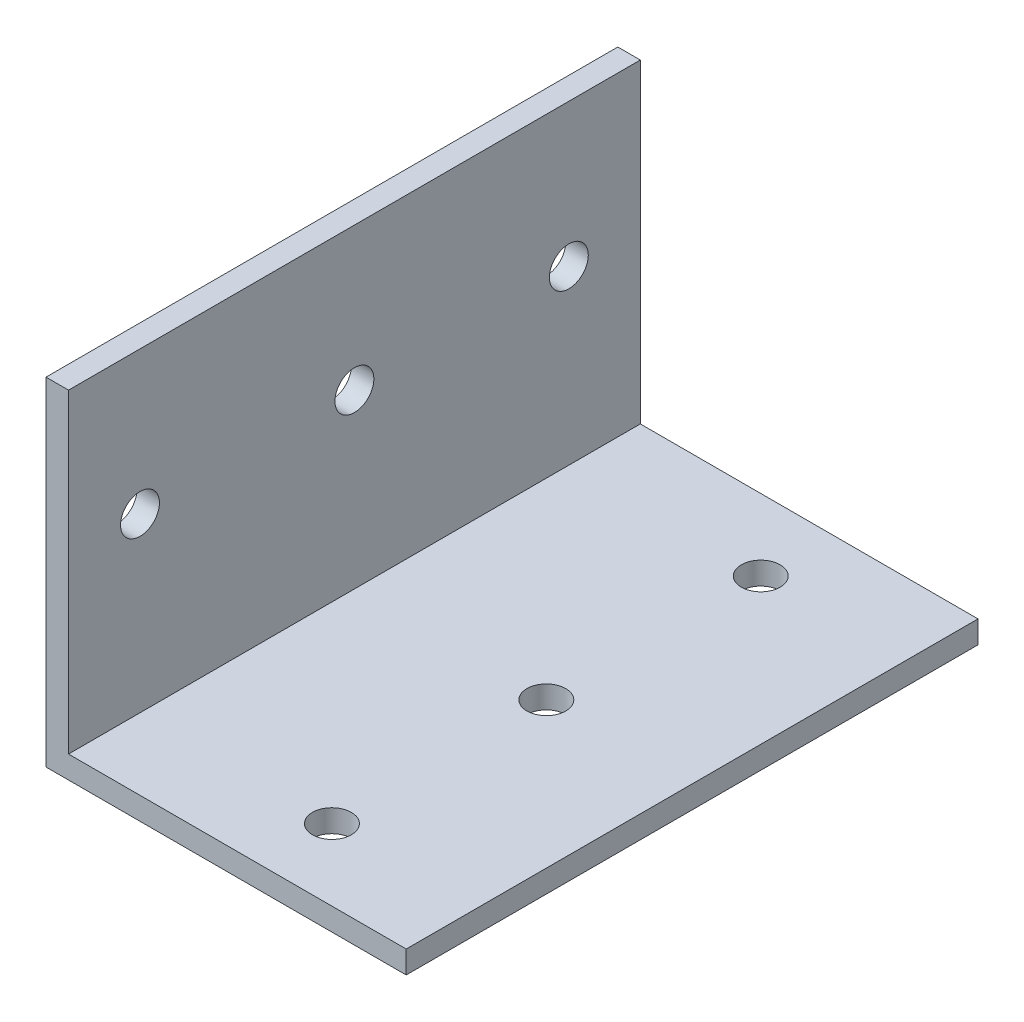
ISO-10303-21;
HEADER;
FILE_DESCRIPTION(('STEP AP214'),'2;1');
FILE_NAME('part.step','',(''),(''),'','','');
FILE_SCHEMA(('AUTOMOTIVE_DESIGN { 1 0 10303 214 1 1 1 1 }'));
ENDSEC;
DATA;
#1=APPLICATION_CONTEXT('core data for automotive mechanical design processes');
#2=APPLICATION_PROTOCOL_DEFINITION('international standard','automotive_design',2000,#1);
#3=PRODUCT_CONTEXT('',#1,'mechanical');
#4=PRODUCT('Part','Part','',(#3));
#5=PRODUCT_RELATED_PRODUCT_CATEGORY('part','',(#4));
#6=PRODUCT_DEFINITION_FORMATION('','',#4);
#7=PRODUCT_DEFINITION_CONTEXT('part definition',#1,'design');
#8=PRODUCT_DEFINITION('design','',#6,#7);
#9=PRODUCT_DEFINITION_SHAPE('','',#8);
#10=(LENGTH_UNIT() NAMED_UNIT(*) SI_UNIT(.MILLI.,.METRE.));
#11=(NAMED_UNIT(*) PLANE_ANGLE_UNIT() SI_UNIT($,.RADIAN.));
#12=(NAMED_UNIT(*) SI_UNIT($,.STERADIAN.) SOLID_ANGLE_UNIT());
#13=UNCERTAINTY_MEASURE_WITH_UNIT(LENGTH_MEASURE(1.E-05),#10,'distance_accuracy_value','');
#14=(GEOMETRIC_REPRESENTATION_CONTEXT(3) GLOBAL_UNCERTAINTY_ASSIGNED_CONTEXT((#13)) GLOBAL_UNIT_ASSIGNED_CONTEXT((#10,
#11,#12)) REPRESENTATION_CONTEXT('',''));
#15=CARTESIAN_POINT('',(0.,0.,0.));
#16=DIRECTION('',(0.,0.,1.));
#17=DIRECTION('',(1.,0.,0.));
#18=AXIS2_PLACEMENT_3D('',#15,#16,#17);
#19=CARTESIAN_POINT('',(0.,0.,50.8));
#20=DIRECTION('',(0.,-1.,0.));
#21=DIRECTION('',(0.,0.,-1.));
#22=AXIS2_PLACEMENT_3D('',#19,#20,#21);
#23=PLANE('',#22);
#24=DIRECTION('',(-1.,0.,0.));
#25=VECTOR('',#24,1.);
#26=CARTESIAN_POINT('',(0.,0.,0.));
#27=LINE('',#26,#25);
#28=CARTESIAN_POINT('',(2.,0.,0.));
#29=VERTEX_POINT('',#28);
#30=CARTESIAN_POINT('',(0.,0.,0.));
#31=VERTEX_POINT('',#30);
#32=EDGE_CURVE('E119',#29,#31,#27,.T.);
#33=ORIENTED_EDGE('',*,*,#32,.T.);
#34=DIRECTION('',(0.,0.,-1.));
#35=VECTOR('',#34,1.);
#36=CARTESIAN_POINT('',(0.,0.,50.8));
#37=LINE('',#36,#35);
#38=CARTESIAN_POINT('',(0.,0.,50.8));
#39=VERTEX_POINT('',#38);
#40=EDGE_CURVE('E11',#39,#31,#37,.T.);
#41=ORIENTED_EDGE('',*,*,#40,.F.);
#42=DIRECTION('',(-1.,0.,0.));
#43=VECTOR('',#42,1.);
#44=CARTESIAN_POINT('',(0.,0.,50.8));
#45=LINE('',#44,#43);
#46=CARTESIAN_POINT('',(2.,0.,50.8));
#47=VERTEX_POINT('',#46);
#48=EDGE_CURVE('E130',#47,#39,#45,.T.);
#49=ORIENTED_EDGE('',*,*,#48,.F.);
#50=DIRECTION('',(0.,0.,-1.));
#51=VECTOR('',#50,1.);
#52=CARTESIAN_POINT('',(2.,0.,50.8));
#53=LINE('',#52,#51);
#54=EDGE_CURVE('E115',#47,#29,#53,.T.);
#55=ORIENTED_EDGE('',*,*,#54,.T.);
#56=EDGE_LOOP('',(#33,#41,#49,#55));
#57=FACE_BOUND('',#56,.T.);
#58=ADVANCED_FACE('F35',(#57),#23,.F.);
#59=CARTESIAN_POINT('',(0.,0.,50.8));
#60=DIRECTION('',(1.,0.,0.));
#61=DIRECTION('',(0.,1.,0.));
#62=AXIS2_PLACEMENT_3D('',#59,#60,#61);
#63=PLANE('',#62);
#64=CARTESIAN_POINT('',(0.,-12.7,44.45));
#65=DIRECTION('',(1.,0.,0.));
#66=DIRECTION('',(0.,1.,0.));
#67=AXIS2_PLACEMENT_3D('',#64,#65,#66);
#68=CIRCLE('',#67,1.7272);
#69=CARTESIAN_POINT('',(0.,-10.9728,44.45));
#70=VERTEX_POINT('',#69);
#71=EDGE_CURVE('E270',#70,#70,#68,.T.);
#72=ORIENTED_EDGE('',*,*,#71,.T.);
#73=EDGE_LOOP('',(#72));
#74=FACE_BOUND('',#73,.T.);
#75=CARTESIAN_POINT('',(0.,-12.7,6.34999999999999));
#76=DIRECTION('',(1.,0.,0.));
#77=DIRECTION('',(0.,1.,0.));
#78=AXIS2_PLACEMENT_3D('',#75,#76,#77);
#79=CIRCLE('',#78,1.7272);
#80=CARTESIAN_POINT('',(0.,-10.9728,6.34999999999999));
#81=VERTEX_POINT('',#80);
#82=EDGE_CURVE('E279',#81,#81,#79,.T.);
#83=ORIENTED_EDGE('',*,*,#82,.T.);
#84=EDGE_LOOP('',(#83));
#85=FACE_BOUND('',#84,.T.);
#86=CARTESIAN_POINT('',(0.,-12.7,25.4));
#87=DIRECTION('',(1.,0.,0.));
#88=DIRECTION('',(0.,1.,0.));
#89=AXIS2_PLACEMENT_3D('',#86,#87,#88);
#90=CIRCLE('',#89,1.7272);
#91=CARTESIAN_POINT('',(0.,-10.9728,25.4));
#92=VERTEX_POINT('',#91);
#93=EDGE_CURVE('E285',#92,#92,#90,.T.);
#94=ORIENTED_EDGE('',*,*,#93,.T.);
#95=EDGE_LOOP('',(#94));
#96=FACE_BOUND('',#95,.T.);
#97=DIRECTION('',(0.,-1.,0.));
#98=VECTOR('',#97,1.);
#99=CARTESIAN_POINT('',(0.,0.,0.));
#100=LINE('',#99,#98);
#101=CARTESIAN_POINT('',(0.,-30.,0.));
#102=VERTEX_POINT('',#101);
#103=EDGE_CURVE('E122',#31,#102,#100,.T.);
#104=ORIENTED_EDGE('',*,*,#103,.T.);
#105=DIRECTION('',(0.,0.,-1.));
#106=VECTOR('',#105,1.);
#107=CARTESIAN_POINT('',(0.,-30.,50.8));
#108=LINE('',#107,#106);
#109=CARTESIAN_POINT('',(0.,-30.,50.8));
#110=VERTEX_POINT('',#109);
#111=EDGE_CURVE('E43',#110,#102,#108,.T.);
#112=ORIENTED_EDGE('',*,*,#111,.F.);
#113=DIRECTION('',(0.,-1.,0.));
#114=VECTOR('',#113,1.);
#115=CARTESIAN_POINT('',(0.,0.,50.8));
#116=LINE('',#115,#114);
#117=EDGE_CURVE('E88',#39,#110,#116,.T.);
#118=ORIENTED_EDGE('',*,*,#117,.F.);
#119=ORIENTED_EDGE('',*,*,#40,.T.);
#120=EDGE_LOOP('',(#104,#112,#118,#119));
#121=FACE_BOUND('',#120,.T.);
#122=ADVANCED_FACE('F158',(#74,#85,#96,#121),#63,.F.);
#123=CARTESIAN_POINT('',(0.,-30.,50.8));
#124=DIRECTION('',(0.,1.,0.));
#125=DIRECTION('',(0.,0.,1.));
#126=AXIS2_PLACEMENT_3D('',#123,#124,#125);
#127=PLANE('',#126);
#128=CARTESIAN_POINT('',(19.05,-30.,6.35));
#129=DIRECTION('',(0.,1.,0.));
#130=DIRECTION('',(0.,0.,1.));
#131=AXIS2_PLACEMENT_3D('',#128,#129,#130);
#132=CIRCLE('',#131,1.7272);
#133=CARTESIAN_POINT('',(19.05,-30.,8.0772));
#134=VERTEX_POINT('',#133);
#135=EDGE_CURVE('E291',#134,#134,#132,.T.);
#136=ORIENTED_EDGE('',*,*,#135,.T.);
#137=EDGE_LOOP('',(#136));
#138=FACE_BOUND('',#137,.T.);
#139=CARTESIAN_POINT('',(19.05,-30.,44.45));
#140=DIRECTION('',(0.,1.,0.));
#141=DIRECTION('',(0.,0.,1.));
#142=AXIS2_PLACEMENT_3D('',#139,#140,#141);
#143=CIRCLE('',#142,1.7272);
#144=CARTESIAN_POINT('',(19.05,-30.,46.1772));
#145=VERTEX_POINT('',#144);
#146=EDGE_CURVE('E297',#145,#145,#143,.T.);
#147=ORIENTED_EDGE('',*,*,#146,.T.);
#148=EDGE_LOOP('',(#147));
#149=FACE_BOUND('',#148,.T.);
#150=CARTESIAN_POINT('',(19.05,-30.,25.4));
#151=DIRECTION('',(0.,1.,0.));
#152=DIRECTION('',(0.,0.,1.));
#153=AXIS2_PLACEMENT_3D('',#150,#151,#152);
#154=CIRCLE('',#153,1.7272);
#155=CARTESIAN_POINT('',(19.05,-30.,27.1272));
#156=VERTEX_POINT('',#155);
#157=EDGE_CURVE('E123',#156,#156,#154,.T.);
#158=ORIENTED_EDGE('',*,*,#157,.T.);
#159=EDGE_LOOP('',(#158));
#160=FACE_BOUND('',#159,.T.);
#161=DIRECTION('',(1.,0.,0.));
#162=VECTOR('',#161,1.);
#163=CARTESIAN_POINT('',(0.,-30.,0.));
#164=LINE('',#163,#162);
#165=CARTESIAN_POINT('',(32.,-30.,0.));
#166=VERTEX_POINT('',#165);
#167=EDGE_CURVE('E125',#102,#166,#164,.T.);
#168=ORIENTED_EDGE('',*,*,#167,.T.);
#169=DIRECTION('',(0.,0.,-1.));
#170=VECTOR('',#169,1.);
#171=CARTESIAN_POINT('',(32.,-30.,50.8));
#172=LINE('',#171,#170);
#173=CARTESIAN_POINT('',(32.,-30.,50.8));
#174=VERTEX_POINT('',#173);
#175=EDGE_CURVE('E110',#174,#166,#172,.T.);
#176=ORIENTED_EDGE('',*,*,#175,.F.);
#177=DIRECTION('',(1.,0.,0.));
#178=VECTOR('',#177,1.);
#179=CARTESIAN_POINT('',(0.,-30.,50.8));
#180=LINE('',#179,#178);
#181=EDGE_CURVE('E101',#110,#174,#180,.T.);
#182=ORIENTED_EDGE('',*,*,#181,.F.);
#183=ORIENTED_EDGE('',*,*,#111,.T.);
#184=EDGE_LOOP('',(#168,#176,#182,#183));
#185=FACE_BOUND('',#184,.T.);
#186=ADVANCED_FACE('F136',(#138,#149,#160,#185),#127,.F.);
#187=CARTESIAN_POINT('',(32.,-30.,50.8));
#188=DIRECTION('',(-1.,0.,0.));
#189=DIRECTION('',(0.,0.,1.));
#190=AXIS2_PLACEMENT_3D('',#187,#188,#189);
#191=PLANE('',#190);
#192=DIRECTION('',(0.,1.,0.));
#193=VECTOR('',#192,1.);
#194=CARTESIAN_POINT('',(32.,-30.,0.));
#195=LINE('',#194,#193);
#196=CARTESIAN_POINT('',(32.,-28.,0.));
#197=VERTEX_POINT('',#196);
#198=EDGE_CURVE('E109',#166,#197,#195,.T.);
#199=ORIENTED_EDGE('',*,*,#198,.T.);
#200=DIRECTION('',(0.,0.,-1.));
#201=VECTOR('',#200,1.);
#202=CARTESIAN_POINT('',(32.,-28.,50.8));
#203=LINE('',#202,#201);
#204=CARTESIAN_POINT('',(32.,-28.,50.8));
#205=VERTEX_POINT('',#204);
#206=EDGE_CURVE('E106',#205,#197,#203,.T.);
#207=ORIENTED_EDGE('',*,*,#206,.F.);
#208=DIRECTION('',(0.,1.,0.));
#209=VECTOR('',#208,1.);
#210=CARTESIAN_POINT('',(32.,-30.,50.8));
#211=LINE('',#210,#209);
#212=EDGE_CURVE('E95',#174,#205,#211,.T.);
#213=ORIENTED_EDGE('',*,*,#212,.F.);
#214=ORIENTED_EDGE('',*,*,#175,.T.);
#215=EDGE_LOOP('',(#199,#207,#213,#214));
#216=FACE_BOUND('',#215,.T.);
#217=ADVANCED_FACE('F107',(#216),#191,.F.);
#218=CARTESIAN_POINT('',(2.,-28.,50.8));
#219=DIRECTION('',(0.,-1.,0.));
#220=DIRECTION('',(0.,0.,-1.));
#221=AXIS2_PLACEMENT_3D('',#218,#219,#220);
#222=PLANE('',#221);
#223=CARTESIAN_POINT('',(19.05,-28.,6.35));
#224=DIRECTION('',(0.,1.,0.));
#225=DIRECTION('',(0.,0.,1.));
#226=AXIS2_PLACEMENT_3D('',#223,#224,#225);
#227=CIRCLE('',#226,1.7272);
#228=CARTESIAN_POINT('',(19.05,-28.,8.0772));
#229=VERTEX_POINT('',#228);
#230=EDGE_CURVE('E288',#229,#229,#227,.T.);
#231=ORIENTED_EDGE('',*,*,#230,.F.);
#232=EDGE_LOOP('',(#231));
#233=FACE_BOUND('',#232,.T.);
#234=CARTESIAN_POINT('',(19.05,-28.,44.45));
#235=DIRECTION('',(0.,1.,0.));
#236=DIRECTION('',(0.,0.,1.));
#237=AXIS2_PLACEMENT_3D('',#234,#235,#236);
#238=CIRCLE('',#237,1.7272);
#239=CARTESIAN_POINT('',(19.05,-28.,46.1772));
#240=VERTEX_POINT('',#239);
#241=EDGE_CURVE('E294',#240,#240,#238,.T.);
#242=ORIENTED_EDGE('',*,*,#241,.F.);
#243=EDGE_LOOP('',(#242));
#244=FACE_BOUND('',#243,.T.);
#245=CARTESIAN_POINT('',(19.05,-28.,25.4));
#246=DIRECTION('',(0.,1.,0.));
#247=DIRECTION('',(0.,0.,1.));
#248=AXIS2_PLACEMENT_3D('',#245,#246,#247);
#249=CIRCLE('',#248,1.7272);
#250=CARTESIAN_POINT('',(19.05,-28.,27.1272));
#251=VERTEX_POINT('',#250);
#252=EDGE_CURVE('E300',#251,#251,#249,.T.);
#253=ORIENTED_EDGE('',*,*,#252,.F.);
#254=EDGE_LOOP('',(#253));
#255=FACE_BOUND('',#254,.T.);
#256=DIRECTION('',(-1.,0.,0.));
#257=VECTOR('',#256,1.);
#258=CARTESIAN_POINT('',(2.,-28.,0.));
#259=LINE('',#258,#257);
#260=CARTESIAN_POINT('',(2.,-28.,0.));
#261=VERTEX_POINT('',#260);
#262=EDGE_CURVE('E74',#197,#261,#259,.T.);
#263=ORIENTED_EDGE('',*,*,#262,.T.);
#264=DIRECTION('',(0.,0.,-1.));
#265=VECTOR('',#264,1.);
#266=CARTESIAN_POINT('',(2.,-28.,50.8));
#267=LINE('',#266,#265);
#268=CARTESIAN_POINT('',(2.,-28.,50.8));
#269=VERTEX_POINT('',#268);
#270=EDGE_CURVE('E111',#269,#261,#267,.T.);
#271=ORIENTED_EDGE('',*,*,#270,.F.);
#272=DIRECTION('',(-1.,0.,0.));
#273=VECTOR('',#272,1.);
#274=CARTESIAN_POINT('',(2.,-28.,50.8));
#275=LINE('',#274,#273);
#276=EDGE_CURVE('E99',#205,#269,#275,.T.);
#277=ORIENTED_EDGE('',*,*,#276,.F.);
#278=ORIENTED_EDGE('',*,*,#206,.T.);
#279=EDGE_LOOP('',(#263,#271,#277,#278));
#280=FACE_BOUND('',#279,.T.);
#281=ADVANCED_FACE('F113',(#233,#244,#255,#280),#222,.F.);
#282=CARTESIAN_POINT('',(2.,0.,50.8));
#283=DIRECTION('',(-1.,0.,0.));
#284=DIRECTION('',(0.,-1.,0.));
#285=AXIS2_PLACEMENT_3D('',#282,#283,#284);
#286=PLANE('',#285);
#287=CARTESIAN_POINT('',(2.,-12.7,44.45));
#288=DIRECTION('',(1.,0.,0.));
#289=DIRECTION('',(0.,0.,-1.));
#290=AXIS2_PLACEMENT_3D('',#287,#288,#289);
#291=CIRCLE('',#290,1.7272);
#292=CARTESIAN_POINT('',(2.,-12.7,42.7228));
#293=VERTEX_POINT('',#292);
#294=EDGE_CURVE('E272',#293,#293,#291,.T.);
#295=ORIENTED_EDGE('',*,*,#294,.F.);
#296=EDGE_LOOP('',(#295));
#297=FACE_BOUND('',#296,.T.);
#298=CARTESIAN_POINT('',(2.,-12.7,6.34999999999999));
#299=DIRECTION('',(1.,0.,0.));
#300=DIRECTION('',(0.,0.,-1.));
#301=AXIS2_PLACEMENT_3D('',#298,#299,#300);
#302=CIRCLE('',#301,1.7272);
#303=CARTESIAN_POINT('',(2.,-12.7,4.62279999999999));
#304=VERTEX_POINT('',#303);
#305=EDGE_CURVE('E274',#304,#304,#302,.T.);
#306=ORIENTED_EDGE('',*,*,#305,.F.);
#307=EDGE_LOOP('',(#306));
#308=FACE_BOUND('',#307,.T.);
#309=CARTESIAN_POINT('',(2.,-12.7,25.4));
#310=DIRECTION('',(1.,0.,0.));
#311=DIRECTION('',(0.,0.,-1.));
#312=AXIS2_PLACEMENT_3D('',#309,#310,#311);
#313=CIRCLE('',#312,1.7272);
#314=CARTESIAN_POINT('',(2.,-12.7,23.6728));
#315=VERTEX_POINT('',#314);
#316=EDGE_CURVE('E282',#315,#315,#313,.T.);
#317=ORIENTED_EDGE('',*,*,#316,.F.);
#318=EDGE_LOOP('',(#317));
#319=FACE_BOUND('',#318,.T.);
#320=DIRECTION('',(0.,1.,0.));
#321=VECTOR('',#320,1.);
#322=CARTESIAN_POINT('',(2.,0.,0.));
#323=LINE('',#322,#321);
#324=EDGE_CURVE('E80',#261,#29,#323,.T.);
#325=ORIENTED_EDGE('',*,*,#324,.T.);
#326=ORIENTED_EDGE('',*,*,#54,.F.);
#327=DIRECTION('',(0.,1.,0.));
#328=VECTOR('',#327,1.);
#329=CARTESIAN_POINT('',(2.,0.,50.8));
#330=LINE('',#329,#328);
#331=EDGE_CURVE('E51',#269,#47,#330,.T.);
#332=ORIENTED_EDGE('',*,*,#331,.F.);
#333=ORIENTED_EDGE('',*,*,#270,.T.);
#334=EDGE_LOOP('',(#325,#326,#332,#333));
#335=FACE_BOUND('',#334,.T.);
#336=ADVANCED_FACE('F143',(#297,#308,#319,#335),#286,.F.);
#337=CARTESIAN_POINT('',(0.,0.,50.8));
#338=DIRECTION('',(0.,0.,-1.));
#339=DIRECTION('',(-1.,0.,0.));
#340=AXIS2_PLACEMENT_3D('',#337,#338,#339);
#341=PLANE('',#340);
#342=ORIENTED_EDGE('',*,*,#48,.T.);
#343=ORIENTED_EDGE('',*,*,#117,.T.);
#344=ORIENTED_EDGE('',*,*,#181,.T.);
#345=ORIENTED_EDGE('',*,*,#212,.T.);
#346=ORIENTED_EDGE('',*,*,#276,.T.);
#347=ORIENTED_EDGE('',*,*,#331,.T.);
#348=EDGE_LOOP('',(#342,#343,#344,#345,#346,#347));
#349=FACE_BOUND('',#348,.T.);
#350=ADVANCED_FACE('F97',(#349),#341,.F.);
#351=CARTESIAN_POINT('',(0.,0.,0.));
#352=DIRECTION('',(0.,0.,-1.));
#353=DIRECTION('',(-1.,0.,0.));
#354=AXIS2_PLACEMENT_3D('',#351,#352,#353);
#355=PLANE('',#354);
#356=ORIENTED_EDGE('',*,*,#32,.F.);
#357=ORIENTED_EDGE('',*,*,#324,.F.);
#358=ORIENTED_EDGE('',*,*,#262,.F.);
#359=ORIENTED_EDGE('',*,*,#198,.F.);
#360=ORIENTED_EDGE('',*,*,#167,.F.);
#361=ORIENTED_EDGE('',*,*,#103,.F.);
#362=EDGE_LOOP('',(#356,#357,#358,#359,#360,#361));
#363=FACE_BOUND('',#362,.T.);
#364=ADVANCED_FACE('F139',(#363),#355,.T.);
#365=CARTESIAN_POINT('',(19.05,-28.,25.4));
#366=DIRECTION('',(0.,1.,0.));
#367=DIRECTION('',(0.,0.,1.));
#368=AXIS2_PLACEMENT_3D('',#365,#366,#367);
#369=CYLINDRICAL_SURFACE('',#368,1.7272);
#370=ORIENTED_EDGE('',*,*,#157,.F.);
#371=EDGE_LOOP('',(#370));
#372=FACE_BOUND('',#371,.T.);
#373=ORIENTED_EDGE('',*,*,#252,.T.);
#374=EDGE_LOOP('',(#373));
#375=FACE_BOUND('',#374,.T.);
#376=ADVANCED_FACE('F190',(#372,#375),#369,.F.);
#377=CARTESIAN_POINT('',(19.05,-28.,44.45));
#378=DIRECTION('',(0.,1.,0.));
#379=DIRECTION('',(0.,0.,1.));
#380=AXIS2_PLACEMENT_3D('',#377,#378,#379);
#381=CYLINDRICAL_SURFACE('',#380,1.7272);
#382=ORIENTED_EDGE('',*,*,#146,.F.);
#383=EDGE_LOOP('',(#382));
#384=FACE_BOUND('',#383,.T.);
#385=ORIENTED_EDGE('',*,*,#241,.T.);
#386=EDGE_LOOP('',(#385));
#387=FACE_BOUND('',#386,.T.);
#388=ADVANCED_FACE('F195',(#384,#387),#381,.F.);
#389=CARTESIAN_POINT('',(19.05,-28.,6.35));
#390=DIRECTION('',(0.,1.,0.));
#391=DIRECTION('',(0.,0.,1.));
#392=AXIS2_PLACEMENT_3D('',#389,#390,#391);
#393=CYLINDRICAL_SURFACE('',#392,1.7272);
#394=ORIENTED_EDGE('',*,*,#135,.F.);
#395=EDGE_LOOP('',(#394));
#396=FACE_BOUND('',#395,.T.);
#397=ORIENTED_EDGE('',*,*,#230,.T.);
#398=EDGE_LOOP('',(#397));
#399=FACE_BOUND('',#398,.T.);
#400=ADVANCED_FACE('F207',(#396,#399),#393,.F.);
#401=CARTESIAN_POINT('',(2.,-12.7,25.4));
#402=DIRECTION('',(1.,0.,0.));
#403=DIRECTION('',(0.,0.,-1.));
#404=AXIS2_PLACEMENT_3D('',#401,#402,#403);
#405=CYLINDRICAL_SURFACE('',#404,1.7272);
#406=ORIENTED_EDGE('',*,*,#93,.F.);
#407=EDGE_LOOP('',(#406));
#408=FACE_BOUND('',#407,.T.);
#409=ORIENTED_EDGE('',*,*,#316,.T.);
#410=EDGE_LOOP('',(#409));
#411=FACE_BOUND('',#410,.T.);
#412=ADVANCED_FACE('F216',(#408,#411),#405,.F.);
#413=CARTESIAN_POINT('',(2.,-12.7,6.34999999999999));
#414=DIRECTION('',(1.,0.,0.));
#415=DIRECTION('',(0.,0.,-1.));
#416=AXIS2_PLACEMENT_3D('',#413,#414,#415);
#417=CYLINDRICAL_SURFACE('',#416,1.7272);
#418=ORIENTED_EDGE('',*,*,#82,.F.);
#419=EDGE_LOOP('',(#418));
#420=FACE_BOUND('',#419,.T.);
#421=ORIENTED_EDGE('',*,*,#305,.T.);
#422=EDGE_LOOP('',(#421));
#423=FACE_BOUND('',#422,.T.);
#424=ADVANCED_FACE('F236',(#420,#423),#417,.F.);
#425=CARTESIAN_POINT('',(2.,-12.7,44.45));
#426=DIRECTION('',(1.,0.,0.));
#427=DIRECTION('',(0.,0.,-1.));
#428=AXIS2_PLACEMENT_3D('',#425,#426,#427);
#429=CYLINDRICAL_SURFACE('',#428,1.7272);
#430=ORIENTED_EDGE('',*,*,#71,.F.);
#431=EDGE_LOOP('',(#430));
#432=FACE_BOUND('',#431,.T.);
#433=ORIENTED_EDGE('',*,*,#294,.T.);
#434=EDGE_LOOP('',(#433));
#435=FACE_BOUND('',#434,.T.);
#436=ADVANCED_FACE('F246',(#432,#435),#429,.F.);
#437=CLOSED_SHELL('',(#58,#122,#186,#217,#281,#336,#350,#364,#376,#388,#400,#412,#424,#436));
#438=MANIFOLD_SOLID_BREP('B2',#437);
#439=ADVANCED_BREP_SHAPE_REPRESENTATION('',(#18,#438),#14);
#440=SHAPE_DEFINITION_REPRESENTATION(#9,#439);
ENDSEC;
END-ISO-10303-21;
